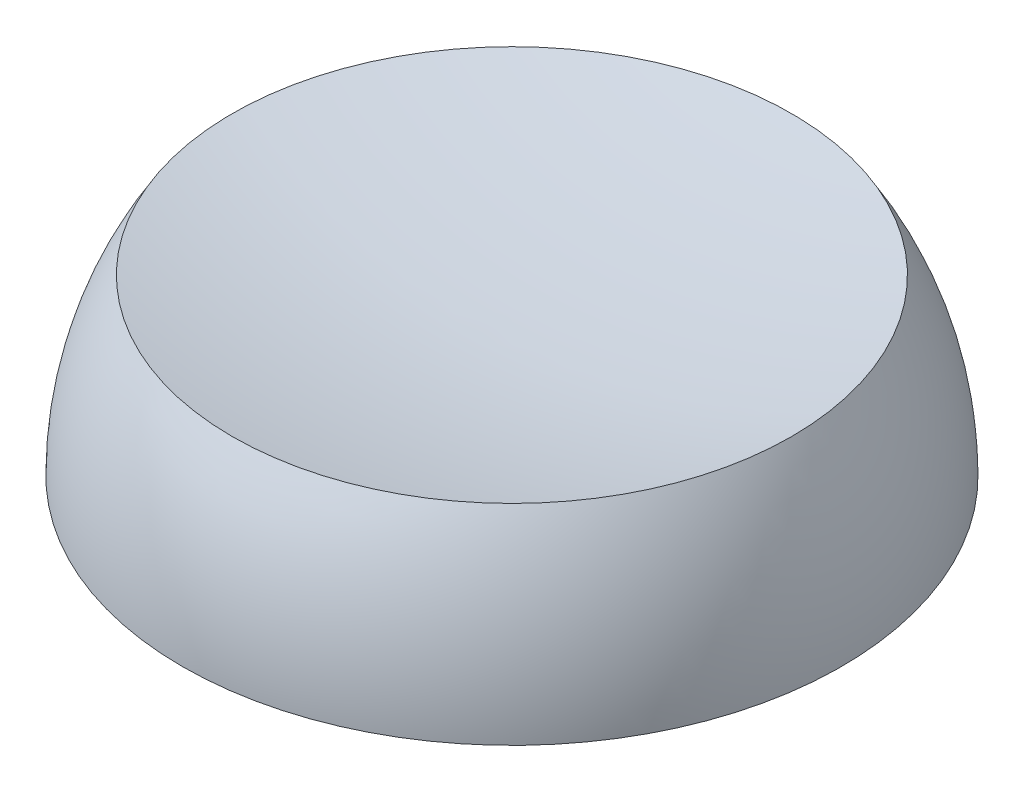
ISO-10303-21;
HEADER;
FILE_DESCRIPTION(('STEP AP214'),'2;1');
FILE_NAME('part.step','',(''),(''),'','','');
FILE_SCHEMA(('AUTOMOTIVE_DESIGN { 1 0 10303 214 1 1 1 1 }'));
ENDSEC;
DATA;
#1=APPLICATION_CONTEXT('core data for automotive mechanical design processes');
#2=APPLICATION_PROTOCOL_DEFINITION('international standard','automotive_design',2000,#1);
#3=PRODUCT_CONTEXT('',#1,'mechanical');
#4=PRODUCT('Part','Part','',(#3));
#5=PRODUCT_RELATED_PRODUCT_CATEGORY('part','',(#4));
#6=PRODUCT_DEFINITION_FORMATION('','',#4);
#7=PRODUCT_DEFINITION_CONTEXT('part definition',#1,'design');
#8=PRODUCT_DEFINITION('design','',#6,#7);
#9=PRODUCT_DEFINITION_SHAPE('','',#8);
#10=(LENGTH_UNIT() NAMED_UNIT(*) SI_UNIT(.MILLI.,.METRE.));
#11=(NAMED_UNIT(*) PLANE_ANGLE_UNIT() SI_UNIT($,.RADIAN.));
#12=(NAMED_UNIT(*) SI_UNIT($,.STERADIAN.) SOLID_ANGLE_UNIT());
#13=UNCERTAINTY_MEASURE_WITH_UNIT(LENGTH_MEASURE(1.E-05),#10,'distance_accuracy_value','');
#14=(GEOMETRIC_REPRESENTATION_CONTEXT(3) GLOBAL_UNCERTAINTY_ASSIGNED_CONTEXT((#13)) GLOBAL_UNIT_ASSIGNED_CONTEXT((#10,
#11,#12)) REPRESENTATION_CONTEXT('',''));
#15=CARTESIAN_POINT('',(0.,0.,0.));
#16=DIRECTION('',(0.,0.,1.));
#17=DIRECTION('',(1.,0.,0.));
#18=AXIS2_PLACEMENT_3D('',#15,#16,#17);
#19=CARTESIAN_POINT('',(0.,41.2658099868109,0.));
#20=DIRECTION('',(0.,1.,0.));
#21=DIRECTION('',(1.,0.,0.));
#22=AXIS2_PLACEMENT_3D('',#19,#20,#21);
#23=SPHERICAL_SURFACE('',#22,36.9648209846573);
#24=CARTESIAN_POINT('',(0.,5.28850740575941,0.));
#25=DIRECTION('',(0.,1.,0.));
#26=DIRECTION('',(0.,0.,1.));
#27=AXIS2_PLACEMENT_3D('',#24,#25,#26);
#28=CIRCLE('',#27,8.4871484857535);
#29=CARTESIAN_POINT('',(0.,5.28850740575941,8.4871484857535));
#30=VERTEX_POINT('',#29);
#31=EDGE_CURVE('E45',#30,#30,#28,.T.);
#32=ORIENTED_EDGE('',*,*,#31,.T.);
#33=EDGE_LOOP('',(#32));
#34=FACE_BOUND('',#33,.T.);
#35=ADVANCED_FACE('F31',(#34),#23,.F.);
#36=CARTESIAN_POINT('',(0.,41.2658099868109,0.));
#37=DIRECTION('',(0.,1.,0.));
#38=DIRECTION('',(-1.,0.,0.));
#39=AXIS2_PLACEMENT_3D('',#36,#37,#38);
#40=SPHERICAL_SURFACE('',#39,37.9648209846573);
#41=CARTESIAN_POINT('',(0.,4.15040249518894,0.));
#42=DIRECTION('',(0.,1.,0.));
#43=DIRECTION('',(0.,0.,1.));
#44=AXIS2_PLACEMENT_3D('',#41,#42,#43);
#45=CIRCLE('',#44,7.9858724713039);
#46=CARTESIAN_POINT('',(0.,4.15040249518894,7.9858724713039));
#47=VERTEX_POINT('',#46);
#48=EDGE_CURVE('E10',#47,#47,#45,.T.);
#49=ORIENTED_EDGE('',*,*,#48,.F.);
#50=EDGE_LOOP('',(#49));
#51=FACE_BOUND('',#50,.T.);
#52=ADVANCED_FACE('F65',(#51),#40,.T.);
#53=CARTESIAN_POINT('',(0.,0.,0.));
#54=DIRECTION('',(0.,1.,0.));
#55=DIRECTION('',(1.,0.,0.));
#56=AXIS2_PLACEMENT_3D('',#53,#54,#55);
#57=SPHERICAL_SURFACE('',#56,9.00000000000001);
#58=CARTESIAN_POINT('',(0.,0.,0.));
#59=DIRECTION('',(0.,1.,0.));
#60=DIRECTION('',(0.,0.,1.));
#61=AXIS2_PLACEMENT_3D('',#58,#59,#60);
#62=CIRCLE('',#61,9.);
#63=CARTESIAN_POINT('',(0.,0.,9.));
#64=VERTEX_POINT('',#63);
#65=EDGE_CURVE('E37',#64,#64,#62,.T.);
#66=ORIENTED_EDGE('',*,*,#65,.F.);
#67=EDGE_LOOP('',(#66));
#68=FACE_BOUND('',#67,.T.);
#69=ORIENTED_EDGE('',*,*,#48,.T.);
#70=EDGE_LOOP('',(#69));
#71=FACE_BOUND('',#70,.T.);
#72=ADVANCED_FACE('F60',(#68,#71),#57,.F.);
#73=CARTESIAN_POINT('',(9.,0.,0.));
#74=DIRECTION('',(0.,1.,0.));
#75=DIRECTION('',(0.,0.,1.));
#76=AXIS2_PLACEMENT_3D('',#73,#74,#75);
#77=PLANE('',#76);
#78=CARTESIAN_POINT('',(0.,0.,0.));
#79=DIRECTION('',(0.,1.,0.));
#80=DIRECTION('',(0.,0.,1.));
#81=AXIS2_PLACEMENT_3D('',#78,#79,#80);
#82=CIRCLE('',#81,10.);
#83=CARTESIAN_POINT('',(0.,0.,10.));
#84=VERTEX_POINT('',#83);
#85=EDGE_CURVE('E41',#84,#84,#82,.T.);
#86=ORIENTED_EDGE('',*,*,#85,.F.);
#87=EDGE_LOOP('',(#86));
#88=FACE_BOUND('',#87,.T.);
#89=ORIENTED_EDGE('',*,*,#65,.T.);
#90=EDGE_LOOP('',(#89));
#91=FACE_BOUND('',#90,.T.);
#92=ADVANCED_FACE('F55',(#88,#91),#77,.F.);
#93=CARTESIAN_POINT('',(0.,0.,0.));
#94=DIRECTION('',(0.,1.,0.));
#95=DIRECTION('',(1.,0.,0.));
#96=AXIS2_PLACEMENT_3D('',#93,#94,#95);
#97=SPHERICAL_SURFACE('',#96,10.);
#98=ORIENTED_EDGE('',*,*,#31,.F.);
#99=EDGE_LOOP('',(#98));
#100=FACE_BOUND('',#99,.T.);
#101=ORIENTED_EDGE('',*,*,#85,.T.);
#102=EDGE_LOOP('',(#101));
#103=FACE_BOUND('',#102,.T.);
#104=ADVANCED_FACE('F52',(#100,#103),#97,.T.);
#105=CLOSED_SHELL('',(#35,#52,#72,#92,#104));
#106=MANIFOLD_SOLID_BREP('B2',#105);
#107=ADVANCED_BREP_SHAPE_REPRESENTATION('',(#18,#106),#14);
#108=SHAPE_DEFINITION_REPRESENTATION(#9,#107);
ENDSEC;
END-ISO-10303-21;
